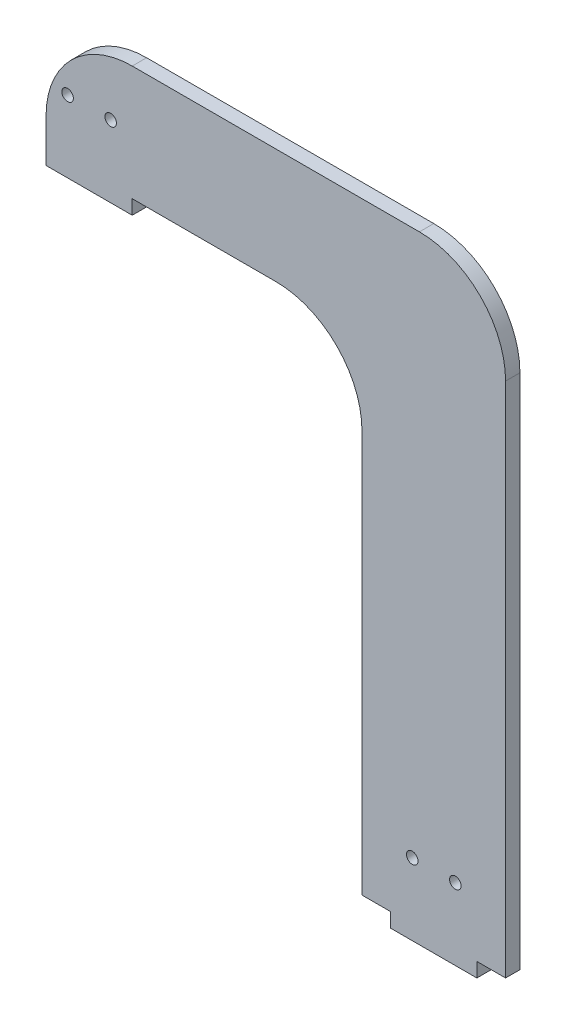
ISO-10303-21;
HEADER;
FILE_DESCRIPTION(('STEP AP214'),'2;1');
FILE_NAME('part.step','',(''),(''),'','','');
FILE_SCHEMA(('AUTOMOTIVE_DESIGN { 1 0 10303 214 1 1 1 1 }'));
ENDSEC;
DATA;
#1=APPLICATION_CONTEXT('core data for automotive mechanical design processes');
#2=APPLICATION_PROTOCOL_DEFINITION('international standard','automotive_design',2000,#1);
#3=PRODUCT_CONTEXT('',#1,'mechanical');
#4=PRODUCT('Part','Part','',(#3));
#5=PRODUCT_RELATED_PRODUCT_CATEGORY('part','',(#4));
#6=PRODUCT_DEFINITION_FORMATION('','',#4);
#7=PRODUCT_DEFINITION_CONTEXT('part definition',#1,'design');
#8=PRODUCT_DEFINITION('design','',#6,#7);
#9=PRODUCT_DEFINITION_SHAPE('','',#8);
#10=(LENGTH_UNIT() NAMED_UNIT(*) SI_UNIT(.MILLI.,.METRE.));
#11=(NAMED_UNIT(*) PLANE_ANGLE_UNIT() SI_UNIT($,.RADIAN.));
#12=(NAMED_UNIT(*) SI_UNIT($,.STERADIAN.) SOLID_ANGLE_UNIT());
#13=UNCERTAINTY_MEASURE_WITH_UNIT(LENGTH_MEASURE(1.E-05),#10,'distance_accuracy_value','');
#14=(GEOMETRIC_REPRESENTATION_CONTEXT(3) GLOBAL_UNCERTAINTY_ASSIGNED_CONTEXT((#13)) GLOBAL_UNIT_ASSIGNED_CONTEXT((#10,
#11,#12)) REPRESENTATION_CONTEXT('',''));
#15=CARTESIAN_POINT('',(0.,0.,0.));
#16=DIRECTION('',(0.,0.,1.));
#17=DIRECTION('',(1.,0.,0.));
#18=AXIS2_PLACEMENT_3D('',#15,#16,#17);
#19=CARTESIAN_POINT('',(-30.,0.,5.));
#20=DIRECTION('',(1.,0.,0.));
#21=DIRECTION('',(0.,0.,-1.));
#22=AXIS2_PLACEMENT_3D('',#19,#20,#21);
#23=PLANE('',#22);
#24=DIRECTION('',(0.,-1.,0.));
#25=VECTOR('',#24,1.);
#26=CARTESIAN_POINT('',(-30.,0.,0.));
#27=LINE('',#26,#25);
#28=CARTESIAN_POINT('',(-30.,5.,0.));
#29=VERTEX_POINT('',#28);
#30=CARTESIAN_POINT('',(-30.,0.,0.));
#31=VERTEX_POINT('',#30);
#32=EDGE_CURVE('E163',#29,#31,#27,.T.);
#33=ORIENTED_EDGE('',*,*,#32,.T.);
#34=DIRECTION('',(0.,0.,-1.));
#35=VECTOR('',#34,1.);
#36=CARTESIAN_POINT('',(-30.,0.,5.));
#37=LINE('',#36,#35);
#38=CARTESIAN_POINT('',(-30.,0.,5.));
#39=VERTEX_POINT('',#38);
#40=EDGE_CURVE('E144',#39,#31,#37,.T.);
#41=ORIENTED_EDGE('',*,*,#40,.F.);
#42=DIRECTION('',(0.,-1.,0.));
#43=VECTOR('',#42,1.);
#44=CARTESIAN_POINT('',(-30.,0.,5.));
#45=LINE('',#44,#43);
#46=CARTESIAN_POINT('',(-30.,5.,5.));
#47=VERTEX_POINT('',#46);
#48=EDGE_CURVE('E150',#47,#39,#45,.T.);
#49=ORIENTED_EDGE('',*,*,#48,.F.);
#50=DIRECTION('',(0.,0.,-1.));
#51=VECTOR('',#50,1.);
#52=CARTESIAN_POINT('',(-30.,5.,5.));
#53=LINE('',#52,#51);
#54=EDGE_CURVE('E215',#47,#29,#53,.T.);
#55=ORIENTED_EDGE('',*,*,#54,.T.);
#56=EDGE_LOOP('',(#33,#41,#49,#55));
#57=FACE_BOUND('',#56,.T.);
#58=ADVANCED_FACE('F33',(#57),#23,.F.);
#59=CARTESIAN_POINT('',(-30.,0.,5.));
#60=DIRECTION('',(0.,1.,0.));
#61=DIRECTION('',(0.,0.,1.));
#62=AXIS2_PLACEMENT_3D('',#59,#60,#61);
#63=PLANE('',#62);
#64=DIRECTION('',(1.,0.,0.));
#65=VECTOR('',#64,1.);
#66=CARTESIAN_POINT('',(-30.,0.,0.));
#67=LINE('',#66,#65);
#68=CARTESIAN_POINT('',(0.,0.,0.));
#69=VERTEX_POINT('',#68);
#70=EDGE_CURVE('E222',#31,#69,#67,.T.);
#71=ORIENTED_EDGE('',*,*,#70,.T.);
#72=DIRECTION('',(0.,0.,-1.));
#73=VECTOR('',#72,1.);
#74=CARTESIAN_POINT('',(0.,0.,5.));
#75=LINE('',#74,#73);
#76=CARTESIAN_POINT('',(0.,0.,5.));
#77=VERTEX_POINT('',#76);
#78=EDGE_CURVE('E147',#77,#69,#75,.T.);
#79=ORIENTED_EDGE('',*,*,#78,.F.);
#80=DIRECTION('',(1.,0.,0.));
#81=VECTOR('',#80,1.);
#82=CARTESIAN_POINT('',(-30.,0.,5.));
#83=LINE('',#82,#81);
#84=EDGE_CURVE('E140',#39,#77,#83,.T.);
#85=ORIENTED_EDGE('',*,*,#84,.F.);
#86=ORIENTED_EDGE('',*,*,#40,.T.);
#87=EDGE_LOOP('',(#71,#79,#85,#86));
#88=FACE_BOUND('',#87,.T.);
#89=ADVANCED_FACE('F142',(#88),#63,.F.);
#90=CARTESIAN_POINT('',(0.,0.,5.));
#91=DIRECTION('',(-1.,0.,0.));
#92=DIRECTION('',(0.,0.,1.));
#93=AXIS2_PLACEMENT_3D('',#90,#91,#92);
#94=PLANE('',#93);
#95=DIRECTION('',(0.,1.,0.));
#96=VECTOR('',#95,1.);
#97=CARTESIAN_POINT('',(0.,0.,0.));
#98=LINE('',#97,#96);
#99=CARTESIAN_POINT('',(0.,5.,0.));
#100=VERTEX_POINT('',#99);
#101=EDGE_CURVE('E225',#69,#100,#98,.T.);
#102=ORIENTED_EDGE('',*,*,#101,.T.);
#103=DIRECTION('',(0.,0.,-1.));
#104=VECTOR('',#103,1.);
#105=CARTESIAN_POINT('',(0.,5.,5.));
#106=LINE('',#105,#104);
#107=CARTESIAN_POINT('',(0.,5.,5.));
#108=VERTEX_POINT('',#107);
#109=EDGE_CURVE('E169',#108,#100,#106,.T.);
#110=ORIENTED_EDGE('',*,*,#109,.F.);
#111=DIRECTION('',(0.,1.,0.));
#112=VECTOR('',#111,1.);
#113=CARTESIAN_POINT('',(0.,0.,5.));
#114=LINE('',#113,#112);
#115=EDGE_CURVE('E149',#77,#108,#114,.T.);
#116=ORIENTED_EDGE('',*,*,#115,.F.);
#117=ORIENTED_EDGE('',*,*,#78,.T.);
#118=EDGE_LOOP('',(#102,#110,#116,#117));
#119=FACE_BOUND('',#118,.T.);
#120=ADVANCED_FACE('F316',(#119),#94,.F.);
#121=CARTESIAN_POINT('',(0.,5.,5.));
#122=DIRECTION('',(0.,1.,0.));
#123=DIRECTION('',(0.,0.,1.));
#124=AXIS2_PLACEMENT_3D('',#121,#122,#123);
#125=PLANE('',#124);
#126=DIRECTION('',(1.,0.,0.));
#127=VECTOR('',#126,1.);
#128=CARTESIAN_POINT('',(0.,5.,0.));
#129=LINE('',#128,#127);
#130=CARTESIAN_POINT('',(10.,5.,0.));
#131=VERTEX_POINT('',#130);
#132=EDGE_CURVE('E227',#100,#131,#129,.T.);
#133=ORIENTED_EDGE('',*,*,#132,.T.);
#134=DIRECTION('',(0.,0.,-1.));
#135=VECTOR('',#134,1.);
#136=CARTESIAN_POINT('',(10.,5.,5.));
#137=LINE('',#136,#135);
#138=CARTESIAN_POINT('',(10.,5.,5.));
#139=VERTEX_POINT('',#138);
#140=EDGE_CURVE('E251',#139,#131,#137,.T.);
#141=ORIENTED_EDGE('',*,*,#140,.F.);
#142=DIRECTION('',(1.,0.,0.));
#143=VECTOR('',#142,1.);
#144=CARTESIAN_POINT('',(0.,5.,5.));
#145=LINE('',#144,#143);
#146=EDGE_CURVE('E260',#108,#139,#145,.T.);
#147=ORIENTED_EDGE('',*,*,#146,.F.);
#148=ORIENTED_EDGE('',*,*,#109,.T.);
#149=EDGE_LOOP('',(#133,#141,#147,#148));
#150=FACE_BOUND('',#149,.T.);
#151=ADVANCED_FACE('F258',(#150),#125,.F.);
#152=CARTESIAN_POINT('',(10.,5.,5.));
#153=DIRECTION('',(-1.,0.,0.));
#154=DIRECTION('',(0.,0.,1.));
#155=AXIS2_PLACEMENT_3D('',#152,#153,#154);
#156=PLANE('',#155);
#157=DIRECTION('',(0.,1.,0.));
#158=VECTOR('',#157,1.);
#159=CARTESIAN_POINT('',(10.,5.,0.));
#160=LINE('',#159,#158);
#161=CARTESIAN_POINT('',(10.,185.,0.));
#162=VERTEX_POINT('',#161);
#163=EDGE_CURVE('E229',#131,#162,#160,.T.);
#164=ORIENTED_EDGE('',*,*,#163,.T.);
#165=DIRECTION('',(0.,0.,-1.));
#166=VECTOR('',#165,1.);
#167=CARTESIAN_POINT('',(10.,185.,5.));
#168=LINE('',#167,#166);
#169=CARTESIAN_POINT('',(10.,185.,5.));
#170=VERTEX_POINT('',#169);
#171=EDGE_CURVE('E185',#162,#170,#168,.F.);
#172=ORIENTED_EDGE('',*,*,#171,.T.);
#173=DIRECTION('',(0.,1.,0.));
#174=VECTOR('',#173,1.);
#175=CARTESIAN_POINT('',(10.,5.,5.));
#176=LINE('',#175,#174);
#177=EDGE_CURVE('E277',#139,#170,#176,.T.);
#178=ORIENTED_EDGE('',*,*,#177,.F.);
#179=ORIENTED_EDGE('',*,*,#140,.T.);
#180=EDGE_LOOP('',(#164,#172,#178,#179));
#181=FACE_BOUND('',#180,.T.);
#182=ADVANCED_FACE('F267',(#181),#156,.F.);
#183=CARTESIAN_POINT('',(10.,215.,5.));
#184=DIRECTION('',(0.,-1.,0.));
#185=DIRECTION('',(1.,0.,0.));
#186=AXIS2_PLACEMENT_3D('',#183,#184,#185);
#187=PLANE('',#186);
#188=DIRECTION('',(-1.,0.,0.));
#189=VECTOR('',#188,1.);
#190=CARTESIAN_POINT('',(10.,215.,0.));
#191=LINE('',#190,#189);
#192=CARTESIAN_POINT('',(-20.,215.,0.));
#193=VERTEX_POINT('',#192);
#194=CARTESIAN_POINT('',(-120.,215.,0.));
#195=VERTEX_POINT('',#194);
#196=EDGE_CURVE('E232',#193,#195,#191,.T.);
#197=ORIENTED_EDGE('',*,*,#196,.T.);
#198=DIRECTION('',(0.,0.,-1.));
#199=VECTOR('',#198,1.);
#200=CARTESIAN_POINT('',(-120.,215.,5.));
#201=LINE('',#200,#199);
#202=CARTESIAN_POINT('',(-120.,215.,5.));
#203=VERTEX_POINT('',#202);
#204=EDGE_CURVE('E179',#195,#203,#201,.F.);
#205=ORIENTED_EDGE('',*,*,#204,.T.);
#206=DIRECTION('',(-1.,0.,0.));
#207=VECTOR('',#206,1.);
#208=CARTESIAN_POINT('',(10.,215.,5.));
#209=LINE('',#208,#207);
#210=CARTESIAN_POINT('',(-20.,215.,5.));
#211=VERTEX_POINT('',#210);
#212=EDGE_CURVE('E275',#211,#203,#209,.T.);
#213=ORIENTED_EDGE('',*,*,#212,.F.);
#214=DIRECTION('',(0.,0.,-1.));
#215=VECTOR('',#214,1.);
#216=CARTESIAN_POINT('',(-20.,215.,5.));
#217=LINE('',#216,#215);
#218=EDGE_CURVE('E176',#211,#193,#217,.T.);
#219=ORIENTED_EDGE('',*,*,#218,.T.);
#220=EDGE_LOOP('',(#197,#205,#213,#219));
#221=FACE_BOUND('',#220,.T.);
#222=ADVANCED_FACE('F279',(#221),#187,.F.);
#223=CARTESIAN_POINT('',(-150.,170.,5.));
#224=DIRECTION('',(1.,0.,0.));
#225=DIRECTION('',(0.,1.,0.));
#226=AXIS2_PLACEMENT_3D('',#223,#224,#225);
#227=PLANE('',#226);
#228=DIRECTION('',(0.,-1.,0.));
#229=VECTOR('',#228,1.);
#230=CARTESIAN_POINT('',(-150.,170.,5.));
#231=LINE('',#230,#229);
#232=CARTESIAN_POINT('',(-150.,185.,5.));
#233=VERTEX_POINT('',#232);
#234=CARTESIAN_POINT('',(-150.,170.,5.));
#235=VERTEX_POINT('',#234);
#236=EDGE_CURVE('E281',#233,#235,#231,.T.);
#237=ORIENTED_EDGE('',*,*,#236,.F.);
#238=DIRECTION('',(0.,0.,-1.));
#239=VECTOR('',#238,1.);
#240=CARTESIAN_POINT('',(-150.,185.,5.));
#241=LINE('',#240,#239);
#242=CARTESIAN_POINT('',(-150.,185.,0.));
#243=VERTEX_POINT('',#242);
#244=EDGE_CURVE('E164',#233,#243,#241,.T.);
#245=ORIENTED_EDGE('',*,*,#244,.T.);
#246=DIRECTION('',(0.,-1.,0.));
#247=VECTOR('',#246,1.);
#248=CARTESIAN_POINT('',(-150.,170.,0.));
#249=LINE('',#248,#247);
#250=CARTESIAN_POINT('',(-150.,170.,0.));
#251=VERTEX_POINT('',#250);
#252=EDGE_CURVE('E235',#243,#251,#249,.T.);
#253=ORIENTED_EDGE('',*,*,#252,.T.);
#254=DIRECTION('',(0.,0.,-1.));
#255=VECTOR('',#254,1.);
#256=CARTESIAN_POINT('',(-150.,170.,5.));
#257=LINE('',#256,#255);
#258=EDGE_CURVE('E248',#235,#251,#257,.T.);
#259=ORIENTED_EDGE('',*,*,#258,.F.);
#260=EDGE_LOOP('',(#237,#245,#253,#259));
#261=FACE_BOUND('',#260,.T.);
#262=ADVANCED_FACE('F299',(#261),#227,.F.);
#263=CARTESIAN_POINT('',(-120.,170.,5.));
#264=DIRECTION('',(0.,1.,0.));
#265=DIRECTION('',(0.,0.,1.));
#266=AXIS2_PLACEMENT_3D('',#263,#264,#265);
#267=PLANE('',#266);
#268=DIRECTION('',(1.,0.,0.));
#269=VECTOR('',#268,1.);
#270=CARTESIAN_POINT('',(-120.,170.,0.));
#271=LINE('',#270,#269);
#272=CARTESIAN_POINT('',(-120.,170.,0.));
#273=VERTEX_POINT('',#272);
#274=EDGE_CURVE('E237',#251,#273,#271,.T.);
#275=ORIENTED_EDGE('',*,*,#274,.T.);
#276=DIRECTION('',(0.,0.,-1.));
#277=VECTOR('',#276,1.);
#278=CARTESIAN_POINT('',(-120.,170.,5.));
#279=LINE('',#278,#277);
#280=CARTESIAN_POINT('',(-120.,170.,5.));
#281=VERTEX_POINT('',#280);
#282=EDGE_CURVE('E245',#281,#273,#279,.T.);
#283=ORIENTED_EDGE('',*,*,#282,.F.);
#284=DIRECTION('',(1.,0.,0.));
#285=VECTOR('',#284,1.);
#286=CARTESIAN_POINT('',(-120.,170.,5.));
#287=LINE('',#286,#285);
#288=EDGE_CURVE('E283',#235,#281,#287,.T.);
#289=ORIENTED_EDGE('',*,*,#288,.F.);
#290=ORIENTED_EDGE('',*,*,#258,.T.);
#291=EDGE_LOOP('',(#275,#283,#289,#290));
#292=FACE_BOUND('',#291,.T.);
#293=ADVANCED_FACE('F295',(#292),#267,.F.);
#294=CARTESIAN_POINT('',(-120.,175.,5.));
#295=DIRECTION('',(-1.,0.,0.));
#296=DIRECTION('',(0.,-1.,0.));
#297=AXIS2_PLACEMENT_3D('',#294,#295,#296);
#298=PLANE('',#297);
#299=DIRECTION('',(0.,1.,0.));
#300=VECTOR('',#299,1.);
#301=CARTESIAN_POINT('',(-120.,175.,0.));
#302=LINE('',#301,#300);
#303=CARTESIAN_POINT('',(-120.,175.,0.));
#304=VERTEX_POINT('',#303);
#305=EDGE_CURVE('E205',#273,#304,#302,.T.);
#306=ORIENTED_EDGE('',*,*,#305,.T.);
#307=DIRECTION('',(0.,0.,-1.));
#308=VECTOR('',#307,1.);
#309=CARTESIAN_POINT('',(-120.,175.,5.));
#310=LINE('',#309,#308);
#311=CARTESIAN_POINT('',(-120.,175.,5.));
#312=VERTEX_POINT('',#311);
#313=EDGE_CURVE('E204',#312,#304,#310,.T.);
#314=ORIENTED_EDGE('',*,*,#313,.F.);
#315=DIRECTION('',(0.,1.,0.));
#316=VECTOR('',#315,1.);
#317=CARTESIAN_POINT('',(-120.,175.,5.));
#318=LINE('',#317,#316);
#319=EDGE_CURVE('E217',#281,#312,#318,.T.);
#320=ORIENTED_EDGE('',*,*,#319,.F.);
#321=ORIENTED_EDGE('',*,*,#282,.T.);
#322=EDGE_LOOP('',(#306,#314,#320,#321));
#323=FACE_BOUND('',#322,.T.);
#324=ADVANCED_FACE('F292',(#323),#298,.F.);
#325=CARTESIAN_POINT('',(-40.,175.,5.));
#326=DIRECTION('',(0.,1.,0.));
#327=DIRECTION('',(-1.,0.,0.));
#328=AXIS2_PLACEMENT_3D('',#325,#326,#327);
#329=PLANE('',#328);
#330=DIRECTION('',(1.,0.,0.));
#331=VECTOR('',#330,1.);
#332=CARTESIAN_POINT('',(-40.,175.,0.));
#333=LINE('',#332,#331);
#334=CARTESIAN_POINT('',(-70.,175.,0.));
#335=VERTEX_POINT('',#334);
#336=EDGE_CURVE('E196',#304,#335,#333,.T.);
#337=ORIENTED_EDGE('',*,*,#336,.T.);
#338=DIRECTION('',(0.,0.,-1.));
#339=VECTOR('',#338,1.);
#340=CARTESIAN_POINT('',(-70.,175.,5.));
#341=LINE('',#340,#339);
#342=CARTESIAN_POINT('',(-70.,175.,5.));
#343=VERTEX_POINT('',#342);
#344=EDGE_CURVE('E54',#335,#343,#341,.F.);
#345=ORIENTED_EDGE('',*,*,#344,.T.);
#346=DIRECTION('',(1.,0.,0.));
#347=VECTOR('',#346,1.);
#348=CARTESIAN_POINT('',(-40.,175.,5.));
#349=LINE('',#348,#347);
#350=EDGE_CURVE('E213',#312,#343,#349,.T.);
#351=ORIENTED_EDGE('',*,*,#350,.F.);
#352=ORIENTED_EDGE('',*,*,#313,.T.);
#353=EDGE_LOOP('',(#337,#345,#351,#352));
#354=FACE_BOUND('',#353,.T.);
#355=ADVANCED_FACE('F202',(#354),#329,.F.);
#356=CARTESIAN_POINT('',(-40.,5.,5.));
#357=DIRECTION('',(1.,0.,0.));
#358=DIRECTION('',(0.,0.,-1.));
#359=AXIS2_PLACEMENT_3D('',#356,#357,#358);
#360=PLANE('',#359);
#361=DIRECTION('',(0.,-1.,0.));
#362=VECTOR('',#361,1.);
#363=CARTESIAN_POINT('',(-40.,5.,5.));
#364=LINE('',#363,#362);
#365=CARTESIAN_POINT('',(-40.,145.,5.));
#366=VERTEX_POINT('',#365);
#367=CARTESIAN_POINT('',(-40.,5.,5.));
#368=VERTEX_POINT('',#367);
#369=EDGE_CURVE('E211',#366,#368,#364,.T.);
#370=ORIENTED_EDGE('',*,*,#369,.F.);
#371=DIRECTION('',(0.,0.,-1.));
#372=VECTOR('',#371,1.);
#373=CARTESIAN_POINT('',(-40.,145.,0.));
#374=LINE('',#373,#372);
#375=CARTESIAN_POINT('',(-40.,145.,0.));
#376=VERTEX_POINT('',#375);
#377=EDGE_CURVE('E187',#366,#376,#374,.T.);
#378=ORIENTED_EDGE('',*,*,#377,.T.);
#379=DIRECTION('',(0.,-1.,0.));
#380=VECTOR('',#379,1.);
#381=CARTESIAN_POINT('',(-40.,5.,0.));
#382=LINE('',#381,#380);
#383=CARTESIAN_POINT('',(-40.,5.,0.));
#384=VERTEX_POINT('',#383);
#385=EDGE_CURVE('E198',#376,#384,#382,.T.);
#386=ORIENTED_EDGE('',*,*,#385,.T.);
#387=DIRECTION('',(0.,0.,-1.));
#388=VECTOR('',#387,1.);
#389=CARTESIAN_POINT('',(-40.,5.,5.));
#390=LINE('',#389,#388);
#391=EDGE_CURVE('E212',#368,#384,#390,.T.);
#392=ORIENTED_EDGE('',*,*,#391,.F.);
#393=EDGE_LOOP('',(#370,#378,#386,#392));
#394=FACE_BOUND('',#393,.T.);
#395=ADVANCED_FACE('F208',(#394),#360,.F.);
#396=CARTESIAN_POINT('',(-30.,5.,5.));
#397=DIRECTION('',(0.,1.,0.));
#398=DIRECTION('',(-1.,0.,0.));
#399=AXIS2_PLACEMENT_3D('',#396,#397,#398);
#400=PLANE('',#399);
#401=DIRECTION('',(1.,0.,0.));
#402=VECTOR('',#401,1.);
#403=CARTESIAN_POINT('',(-30.,5.,0.));
#404=LINE('',#403,#402);
#405=EDGE_CURVE('E160',#384,#29,#404,.T.);
#406=ORIENTED_EDGE('',*,*,#405,.T.);
#407=ORIENTED_EDGE('',*,*,#54,.F.);
#408=DIRECTION('',(1.,0.,0.));
#409=VECTOR('',#408,1.);
#410=CARTESIAN_POINT('',(-30.,5.,5.));
#411=LINE('',#410,#409);
#412=EDGE_CURVE('E156',#368,#47,#411,.T.);
#413=ORIENTED_EDGE('',*,*,#412,.F.);
#414=ORIENTED_EDGE('',*,*,#391,.T.);
#415=EDGE_LOOP('',(#406,#407,#413,#414));
#416=FACE_BOUND('',#415,.T.);
#417=ADVANCED_FACE('F337',(#416),#400,.F.);
#418=CARTESIAN_POINT('',(0.,0.,5.));
#419=DIRECTION('',(0.,0.,1.));
#420=DIRECTION('',(1.,0.,0.));
#421=AXIS2_PLACEMENT_3D('',#418,#419,#420);
#422=PLANE('',#421);
#423=CARTESIAN_POINT('',(-7.5,25.,5.));
#424=DIRECTION('',(0.,0.,1.));
#425=DIRECTION('',(1.,0.,0.));
#426=AXIS2_PLACEMENT_3D('',#423,#424,#425);
#427=CIRCLE('',#426,2.);
#428=CARTESIAN_POINT('',(-5.5,25.,5.));
#429=VERTEX_POINT('',#428);
#430=EDGE_CURVE('E364',#429,#429,#427,.T.);
#431=ORIENTED_EDGE('',*,*,#430,.F.);
#432=EDGE_LOOP('',(#431));
#433=FACE_BOUND('',#432,.T.);
#434=CARTESIAN_POINT('',(-22.5,25.,5.));
#435=DIRECTION('',(0.,0.,1.));
#436=DIRECTION('',(-1.,0.,0.));
#437=AXIS2_PLACEMENT_3D('',#434,#435,#436);
#438=CIRCLE('',#437,2.);
#439=CARTESIAN_POINT('',(-24.5,25.,5.));
#440=VERTEX_POINT('',#439);
#441=EDGE_CURVE('E371',#440,#440,#438,.T.);
#442=ORIENTED_EDGE('',*,*,#441,.F.);
#443=EDGE_LOOP('',(#442));
#444=FACE_BOUND('',#443,.T.);
#445=CARTESIAN_POINT('',(-127.5,195.,5.));
#446=DIRECTION('',(0.,0.,1.));
#447=DIRECTION('',(1.,0.,0.));
#448=AXIS2_PLACEMENT_3D('',#445,#446,#447);
#449=CIRCLE('',#448,2.);
#450=CARTESIAN_POINT('',(-125.5,195.,5.));
#451=VERTEX_POINT('',#450);
#452=EDGE_CURVE('E377',#451,#451,#449,.T.);
#453=ORIENTED_EDGE('',*,*,#452,.F.);
#454=EDGE_LOOP('',(#453));
#455=FACE_BOUND('',#454,.T.);
#456=CARTESIAN_POINT('',(-142.5,195.,5.));
#457=DIRECTION('',(0.,0.,1.));
#458=DIRECTION('',(-1.,0.,0.));
#459=AXIS2_PLACEMENT_3D('',#456,#457,#458);
#460=CIRCLE('',#459,2.);
#461=CARTESIAN_POINT('',(-144.5,195.,5.));
#462=VERTEX_POINT('',#461);
#463=EDGE_CURVE('E383',#462,#462,#460,.T.);
#464=ORIENTED_EDGE('',*,*,#463,.F.);
#465=EDGE_LOOP('',(#464));
#466=FACE_BOUND('',#465,.T.);
#467=ORIENTED_EDGE('',*,*,#212,.T.);
#468=CARTESIAN_POINT('',(-120.,185.,5.));
#469=DIRECTION('',(0.,0.,1.));
#470=DIRECTION('',(1.,0.,0.));
#471=AXIS2_PLACEMENT_3D('',#468,#469,#470);
#472=CIRCLE('',#471,30.);
#473=EDGE_CURVE('E183',#203,#233,#472,.T.);
#474=ORIENTED_EDGE('',*,*,#473,.T.);
#475=ORIENTED_EDGE('',*,*,#236,.T.);
#476=ORIENTED_EDGE('',*,*,#288,.T.);
#477=ORIENTED_EDGE('',*,*,#319,.T.);
#478=ORIENTED_EDGE('',*,*,#350,.T.);
#479=CARTESIAN_POINT('',(-70.,145.,5.));
#480=DIRECTION('',(0.,0.,1.));
#481=DIRECTION('',(1.,0.,0.));
#482=AXIS2_PLACEMENT_3D('',#479,#480,#481);
#483=CIRCLE('',#482,30.);
#484=EDGE_CURVE('E11',#343,#366,#483,.F.);
#485=ORIENTED_EDGE('',*,*,#484,.T.);
#486=ORIENTED_EDGE('',*,*,#369,.T.);
#487=ORIENTED_EDGE('',*,*,#412,.T.);
#488=ORIENTED_EDGE('',*,*,#48,.T.);
#489=ORIENTED_EDGE('',*,*,#84,.T.);
#490=ORIENTED_EDGE('',*,*,#115,.T.);
#491=ORIENTED_EDGE('',*,*,#146,.T.);
#492=ORIENTED_EDGE('',*,*,#177,.T.);
#493=CARTESIAN_POINT('',(-20.,185.,5.));
#494=DIRECTION('',(0.,0.,1.));
#495=DIRECTION('',(1.,0.,0.));
#496=AXIS2_PLACEMENT_3D('',#493,#494,#495);
#497=CIRCLE('',#496,30.);
#498=EDGE_CURVE('E181',#170,#211,#497,.T.);
#499=ORIENTED_EDGE('',*,*,#498,.T.);
#500=EDGE_LOOP('',(#467,#474,#475,#476,#477,#478,#485,#486,#487,#488,#489,#490,#491,#492,#499));
#501=FACE_BOUND('',#500,.T.);
#502=ADVANCED_FACE('F154',(#433,#444,#455,#466,#501),#422,.T.);
#503=CARTESIAN_POINT('',(0.,0.,0.));
#504=DIRECTION('',(0.,0.,1.));
#505=DIRECTION('',(1.,0.,0.));
#506=AXIS2_PLACEMENT_3D('',#503,#504,#505);
#507=PLANE('',#506);
#508=CARTESIAN_POINT('',(-7.5,25.,0.));
#509=DIRECTION('',(0.,0.,1.));
#510=DIRECTION('',(1.,0.,0.));
#511=AXIS2_PLACEMENT_3D('',#508,#509,#510);
#512=CIRCLE('',#511,2.);
#513=CARTESIAN_POINT('',(-5.5,25.,0.));
#514=VERTEX_POINT('',#513);
#515=EDGE_CURVE('E223',#514,#514,#512,.F.);
#516=ORIENTED_EDGE('',*,*,#515,.F.);
#517=EDGE_LOOP('',(#516));
#518=FACE_BOUND('',#517,.T.);
#519=CARTESIAN_POINT('',(-22.5,25.,0.));
#520=DIRECTION('',(0.,0.,1.));
#521=DIRECTION('',(1.,0.,0.));
#522=AXIS2_PLACEMENT_3D('',#519,#520,#521);
#523=CIRCLE('',#522,2.);
#524=CARTESIAN_POINT('',(-20.5,25.,0.));
#525=VERTEX_POINT('',#524);
#526=EDGE_CURVE('E368',#525,#525,#523,.F.);
#527=ORIENTED_EDGE('',*,*,#526,.F.);
#528=EDGE_LOOP('',(#527));
#529=FACE_BOUND('',#528,.T.);
#530=CARTESIAN_POINT('',(-127.5,195.,0.));
#531=DIRECTION('',(0.,0.,1.));
#532=DIRECTION('',(1.,0.,0.));
#533=AXIS2_PLACEMENT_3D('',#530,#531,#532);
#534=CIRCLE('',#533,2.);
#535=CARTESIAN_POINT('',(-125.5,195.,0.));
#536=VERTEX_POINT('',#535);
#537=EDGE_CURVE('E374',#536,#536,#534,.F.);
#538=ORIENTED_EDGE('',*,*,#537,.F.);
#539=EDGE_LOOP('',(#538));
#540=FACE_BOUND('',#539,.T.);
#541=CARTESIAN_POINT('',(-142.5,195.,0.));
#542=DIRECTION('',(0.,0.,1.));
#543=DIRECTION('',(1.,0.,0.));
#544=AXIS2_PLACEMENT_3D('',#541,#542,#543);
#545=CIRCLE('',#544,2.);
#546=CARTESIAN_POINT('',(-140.5,195.,0.));
#547=VERTEX_POINT('',#546);
#548=EDGE_CURVE('E380',#547,#547,#545,.F.);
#549=ORIENTED_EDGE('',*,*,#548,.F.);
#550=EDGE_LOOP('',(#549));
#551=FACE_BOUND('',#550,.T.);
#552=ORIENTED_EDGE('',*,*,#252,.F.);
#553=CARTESIAN_POINT('',(-120.,185.,0.));
#554=DIRECTION('',(0.,0.,1.));
#555=DIRECTION('',(1.,0.,0.));
#556=AXIS2_PLACEMENT_3D('',#553,#554,#555);
#557=CIRCLE('',#556,30.);
#558=EDGE_CURVE('E174',#243,#195,#557,.F.);
#559=ORIENTED_EDGE('',*,*,#558,.T.);
#560=ORIENTED_EDGE('',*,*,#196,.F.);
#561=CARTESIAN_POINT('',(-20.,185.,0.));
#562=DIRECTION('',(0.,0.,1.));
#563=DIRECTION('',(1.,0.,0.));
#564=AXIS2_PLACEMENT_3D('',#561,#562,#563);
#565=CIRCLE('',#564,30.);
#566=EDGE_CURVE('E167',#193,#162,#565,.F.);
#567=ORIENTED_EDGE('',*,*,#566,.T.);
#568=ORIENTED_EDGE('',*,*,#163,.F.);
#569=ORIENTED_EDGE('',*,*,#132,.F.);
#570=ORIENTED_EDGE('',*,*,#101,.F.);
#571=ORIENTED_EDGE('',*,*,#70,.F.);
#572=ORIENTED_EDGE('',*,*,#32,.F.);
#573=ORIENTED_EDGE('',*,*,#405,.F.);
#574=ORIENTED_EDGE('',*,*,#385,.F.);
#575=CARTESIAN_POINT('',(-70.,145.,0.));
#576=DIRECTION('',(0.,0.,1.));
#577=DIRECTION('',(1.,0.,0.));
#578=AXIS2_PLACEMENT_3D('',#575,#576,#577);
#579=CIRCLE('',#578,30.);
#580=EDGE_CURVE('E41',#376,#335,#579,.T.);
#581=ORIENTED_EDGE('',*,*,#580,.T.);
#582=ORIENTED_EDGE('',*,*,#336,.F.);
#583=ORIENTED_EDGE('',*,*,#305,.F.);
#584=ORIENTED_EDGE('',*,*,#274,.F.);
#585=EDGE_LOOP('',(#552,#559,#560,#567,#568,#569,#570,#571,#572,#573,#574,#581,#582,#583,#584));
#586=FACE_BOUND('',#585,.T.);
#587=ADVANCED_FACE('F194',(#518,#529,#540,#551,#586),#507,.F.);
#588=CARTESIAN_POINT('',(-120.,185.,5.));
#589=DIRECTION('',(0.,0.,-1.));
#590=DIRECTION('',(-1.,0.,0.));
#591=AXIS2_PLACEMENT_3D('',#588,#589,#590);
#592=CYLINDRICAL_SURFACE('',#591,30.);
#593=ORIENTED_EDGE('',*,*,#473,.F.);
#594=ORIENTED_EDGE('',*,*,#204,.F.);
#595=ORIENTED_EDGE('',*,*,#558,.F.);
#596=ORIENTED_EDGE('',*,*,#244,.F.);
#597=EDGE_LOOP('',(#593,#594,#595,#596));
#598=FACE_BOUND('',#597,.T.);
#599=ADVANCED_FACE('F302',(#598),#592,.T.);
#600=CARTESIAN_POINT('',(-20.,185.,5.));
#601=DIRECTION('',(0.,0.,-1.));
#602=DIRECTION('',(-1.,0.,0.));
#603=AXIS2_PLACEMENT_3D('',#600,#601,#602);
#604=CYLINDRICAL_SURFACE('',#603,30.);
#605=ORIENTED_EDGE('',*,*,#498,.F.);
#606=ORIENTED_EDGE('',*,*,#171,.F.);
#607=ORIENTED_EDGE('',*,*,#566,.F.);
#608=ORIENTED_EDGE('',*,*,#218,.F.);
#609=EDGE_LOOP('',(#605,#606,#607,#608));
#610=FACE_BOUND('',#609,.T.);
#611=ADVANCED_FACE('F272',(#610),#604,.T.);
#612=CARTESIAN_POINT('',(-70.,145.,5.));
#613=DIRECTION('',(0.,0.,1.));
#614=DIRECTION('',(1.,0.,0.));
#615=AXIS2_PLACEMENT_3D('',#612,#613,#614);
#616=CYLINDRICAL_SURFACE('',#615,30.);
#617=ORIENTED_EDGE('',*,*,#484,.F.);
#618=ORIENTED_EDGE('',*,*,#344,.F.);
#619=ORIENTED_EDGE('',*,*,#580,.F.);
#620=ORIENTED_EDGE('',*,*,#377,.F.);
#621=EDGE_LOOP('',(#617,#618,#619,#620));
#622=FACE_BOUND('',#621,.T.);
#623=ADVANCED_FACE('F35',(#622),#616,.F.);
#624=CARTESIAN_POINT('',(-142.5,195.,-0.00100000000000013));
#625=DIRECTION('',(0.,0.,1.));
#626=DIRECTION('',(1.,0.,0.));
#627=AXIS2_PLACEMENT_3D('',#624,#625,#626);
#628=CYLINDRICAL_SURFACE('',#627,2.);
#629=ORIENTED_EDGE('',*,*,#463,.T.);
#630=EDGE_LOOP('',(#629));
#631=FACE_BOUND('',#630,.T.);
#632=ORIENTED_EDGE('',*,*,#548,.T.);
#633=EDGE_LOOP('',(#632));
#634=FACE_BOUND('',#633,.T.);
#635=ADVANCED_FACE('F344',(#631,#634),#628,.F.);
#636=CARTESIAN_POINT('',(-127.5,195.,-0.00100000000000013));
#637=DIRECTION('',(0.,0.,1.));
#638=DIRECTION('',(1.,0.,0.));
#639=AXIS2_PLACEMENT_3D('',#636,#637,#638);
#640=CYLINDRICAL_SURFACE('',#639,2.);
#641=ORIENTED_EDGE('',*,*,#452,.T.);
#642=EDGE_LOOP('',(#641));
#643=FACE_BOUND('',#642,.T.);
#644=ORIENTED_EDGE('',*,*,#537,.T.);
#645=EDGE_LOOP('',(#644));
#646=FACE_BOUND('',#645,.T.);
#647=ADVANCED_FACE('F347',(#643,#646),#640,.F.);
#648=CARTESIAN_POINT('',(-22.5,25.,-0.00100000000000013));
#649=DIRECTION('',(0.,0.,1.));
#650=DIRECTION('',(1.,0.,0.));
#651=AXIS2_PLACEMENT_3D('',#648,#649,#650);
#652=CYLINDRICAL_SURFACE('',#651,2.);
#653=ORIENTED_EDGE('',*,*,#441,.T.);
#654=EDGE_LOOP('',(#653));
#655=FACE_BOUND('',#654,.T.);
#656=ORIENTED_EDGE('',*,*,#526,.T.);
#657=EDGE_LOOP('',(#656));
#658=FACE_BOUND('',#657,.T.);
#659=ADVANCED_FACE('F351',(#655,#658),#652,.F.);
#660=CARTESIAN_POINT('',(-7.5,25.,-0.00100000000000013));
#661=DIRECTION('',(0.,0.,1.));
#662=DIRECTION('',(1.,0.,0.));
#663=AXIS2_PLACEMENT_3D('',#660,#661,#662);
#664=CYLINDRICAL_SURFACE('',#663,2.);
#665=ORIENTED_EDGE('',*,*,#430,.T.);
#666=EDGE_LOOP('',(#665));
#667=FACE_BOUND('',#666,.T.);
#668=ORIENTED_EDGE('',*,*,#515,.T.);
#669=EDGE_LOOP('',(#668));
#670=FACE_BOUND('',#669,.T.);
#671=ADVANCED_FACE('F355',(#667,#670),#664,.F.);
#672=CLOSED_SHELL('',(#58,#89,#120,#151,#182,#222,#262,#293,#324,#355,#395,#417,#502,#587,#599,
#611,#623,#635,#647,#659,#671));
#673=MANIFOLD_SOLID_BREP('B2',#672);
#674=ADVANCED_BREP_SHAPE_REPRESENTATION('',(#18,#673),#14);
#675=SHAPE_DEFINITION_REPRESENTATION(#9,#674);
ENDSEC;
END-ISO-10303-21;
